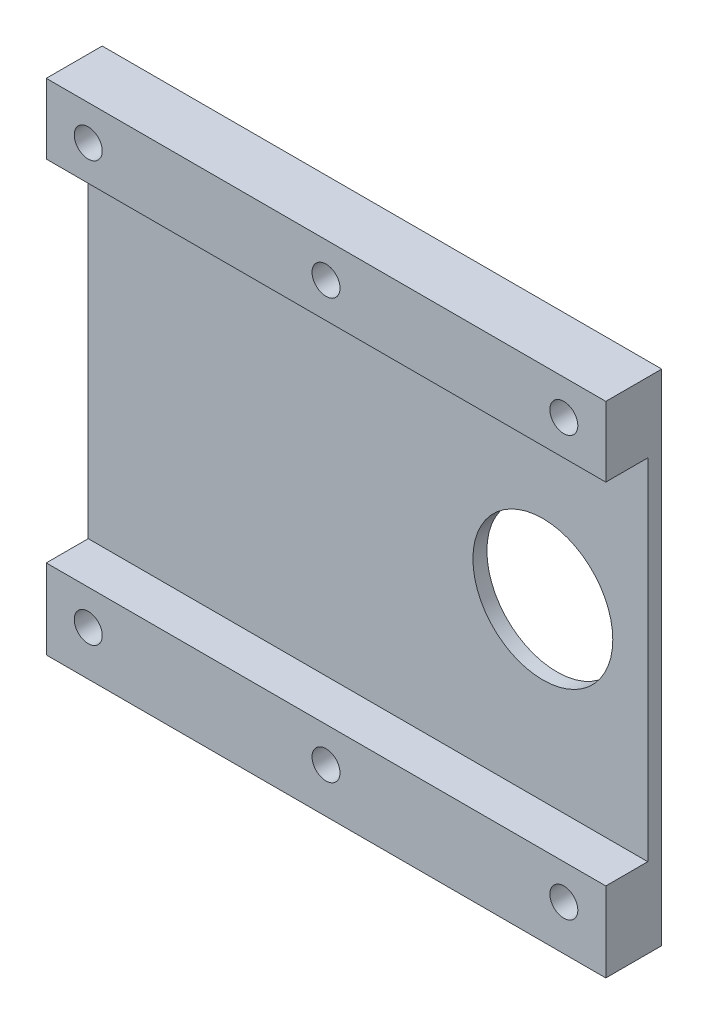
ISO-10303-21;
HEADER;
FILE_DESCRIPTION(('STEP AP214'),'2;1');
FILE_NAME('part.step','',(''),(''),'','','');
FILE_SCHEMA(('AUTOMOTIVE_DESIGN { 1 0 10303 214 1 1 1 1 }'));
ENDSEC;
DATA;
#1=APPLICATION_CONTEXT('core data for automotive mechanical design processes');
#2=APPLICATION_PROTOCOL_DEFINITION('international standard','automotive_design',2000,#1);
#3=PRODUCT_CONTEXT('',#1,'mechanical');
#4=PRODUCT('Part','Part','',(#3));
#5=PRODUCT_RELATED_PRODUCT_CATEGORY('part','',(#4));
#6=PRODUCT_DEFINITION_FORMATION('','',#4);
#7=PRODUCT_DEFINITION_CONTEXT('part definition',#1,'design');
#8=PRODUCT_DEFINITION('design','',#6,#7);
#9=PRODUCT_DEFINITION_SHAPE('','',#8);
#10=(LENGTH_UNIT() NAMED_UNIT(*) SI_UNIT(.MILLI.,.METRE.));
#11=(NAMED_UNIT(*) PLANE_ANGLE_UNIT() SI_UNIT($,.RADIAN.));
#12=(NAMED_UNIT(*) SI_UNIT($,.STERADIAN.) SOLID_ANGLE_UNIT());
#13=UNCERTAINTY_MEASURE_WITH_UNIT(LENGTH_MEASURE(1.E-05),#10,'distance_accuracy_value','');
#14=(GEOMETRIC_REPRESENTATION_CONTEXT(3) GLOBAL_UNCERTAINTY_ASSIGNED_CONTEXT((#13)) GLOBAL_UNIT_ASSIGNED_CONTEXT((#10,
#11,#12)) REPRESENTATION_CONTEXT('',''));
#15=CARTESIAN_POINT('',(0.,0.,0.));
#16=DIRECTION('',(0.,0.,1.));
#17=DIRECTION('',(1.,0.,0.));
#18=AXIS2_PLACEMENT_3D('',#15,#16,#17);
#19=CARTESIAN_POINT('',(0.,0.,4.));
#20=DIRECTION('',(0.,0.,1.));
#21=DIRECTION('',(1.,0.,0.));
#22=AXIS2_PLACEMENT_3D('',#19,#20,#21);
#23=PLANE('',#22);
#24=DIRECTION('',(1.,0.,0.));
#25=VECTOR('',#24,1.);
#26=CARTESIAN_POINT('',(-25.,-12.15,4.));
#27=LINE('',#26,#25);
#28=CARTESIAN_POINT('',(-20.,-12.15,4.));
#29=VERTEX_POINT('',#28);
#30=CARTESIAN_POINT('',(20.,-12.15,4.));
#31=VERTEX_POINT('',#30);
#32=EDGE_CURVE('E127',#29,#31,#27,.T.);
#33=ORIENTED_EDGE('',*,*,#32,.F.);
#34=DIRECTION('',(0.,-1.,0.));
#35=VECTOR('',#34,1.);
#36=CARTESIAN_POINT('',(-20.,17.85,4.));
#37=LINE('',#36,#35);
#38=CARTESIAN_POINT('',(-20.,-17.85,4.));
#39=VERTEX_POINT('',#38);
#40=EDGE_CURVE('E144',#29,#39,#37,.T.);
#41=ORIENTED_EDGE('',*,*,#40,.T.);
#42=DIRECTION('',(1.,0.,0.));
#43=VECTOR('',#42,1.);
#44=CARTESIAN_POINT('',(-20.,-17.85,4.));
#45=LINE('',#44,#43);
#46=CARTESIAN_POINT('',(20.,-17.85,4.));
#47=VERTEX_POINT('',#46);
#48=EDGE_CURVE('E62',#39,#47,#45,.T.);
#49=ORIENTED_EDGE('',*,*,#48,.T.);
#50=DIRECTION('',(0.,1.,0.));
#51=VECTOR('',#50,1.);
#52=CARTESIAN_POINT('',(20.,17.85,4.));
#53=LINE('',#52,#51);
#54=EDGE_CURVE('E134',#47,#31,#53,.T.);
#55=ORIENTED_EDGE('',*,*,#54,.T.);
#56=EDGE_LOOP('',(#33,#41,#49,#55));
#57=FACE_BOUND('',#56,.T.);
#58=CARTESIAN_POINT('',(17.,-14.65,4.));
#59=DIRECTION('',(0.,0.,1.));
#60=DIRECTION('',(1.,0.,0.));
#61=AXIS2_PLACEMENT_3D('',#58,#59,#60);
#62=CIRCLE('',#61,1.);
#63=CARTESIAN_POINT('',(18.,-14.65,4.));
#64=VERTEX_POINT('',#63);
#65=EDGE_CURVE('E183',#64,#64,#62,.T.);
#66=ORIENTED_EDGE('',*,*,#65,.F.);
#67=EDGE_LOOP('',(#66));
#68=FACE_BOUND('',#67,.T.);
#69=CARTESIAN_POINT('',(0.,-14.65,4.));
#70=DIRECTION('',(0.,0.,1.));
#71=DIRECTION('',(1.,0.,0.));
#72=AXIS2_PLACEMENT_3D('',#69,#70,#71);
#73=CIRCLE('',#72,1.);
#74=CARTESIAN_POINT('',(1.00000000000001,-14.65,4.));
#75=VERTEX_POINT('',#74);
#76=EDGE_CURVE('E195',#75,#75,#73,.T.);
#77=ORIENTED_EDGE('',*,*,#76,.F.);
#78=EDGE_LOOP('',(#77));
#79=FACE_BOUND('',#78,.T.);
#80=CARTESIAN_POINT('',(-17.,-14.65,4.));
#81=DIRECTION('',(0.,0.,1.));
#82=DIRECTION('',(1.,0.,0.));
#83=AXIS2_PLACEMENT_3D('',#80,#81,#82);
#84=CIRCLE('',#83,1.);
#85=CARTESIAN_POINT('',(-16.,-14.65,4.));
#86=VERTEX_POINT('',#85);
#87=EDGE_CURVE('E189',#86,#86,#84,.T.);
#88=ORIENTED_EDGE('',*,*,#87,.F.);
#89=EDGE_LOOP('',(#88));
#90=FACE_BOUND('',#89,.T.);
#91=ADVANCED_FACE('F37',(#57,#68,#79,#90),#23,.T.);
#92=DIRECTION('',(-1.,0.,0.));
#93=VECTOR('',#92,1.);
#94=CARTESIAN_POINT('',(-25.,12.85,4.));
#95=LINE('',#94,#93);
#96=CARTESIAN_POINT('',(20.,12.85,4.));
#97=VERTEX_POINT('',#96);
#98=CARTESIAN_POINT('',(-20.,12.85,4.));
#99=VERTEX_POINT('',#98);
#100=EDGE_CURVE('E115',#97,#99,#95,.T.);
#101=ORIENTED_EDGE('',*,*,#100,.F.);
#102=CARTESIAN_POINT('',(20.,17.85,4.));
#103=VERTEX_POINT('',#102);
#104=EDGE_CURVE('E91',#97,#103,#53,.T.);
#105=ORIENTED_EDGE('',*,*,#104,.T.);
#106=DIRECTION('',(-1.,0.,0.));
#107=VECTOR('',#106,1.);
#108=CARTESIAN_POINT('',(-20.,17.85,4.));
#109=LINE('',#108,#107);
#110=CARTESIAN_POINT('',(-20.,17.85,4.));
#111=VERTEX_POINT('',#110);
#112=EDGE_CURVE('E136',#103,#111,#109,.T.);
#113=ORIENTED_EDGE('',*,*,#112,.T.);
#114=EDGE_CURVE('E126',#111,#99,#37,.T.);
#115=ORIENTED_EDGE('',*,*,#114,.T.);
#116=EDGE_LOOP('',(#101,#105,#113,#115));
#117=FACE_BOUND('',#116,.T.);
#118=CARTESIAN_POINT('',(17.,15.35,4.));
#119=DIRECTION('',(0.,0.,1.));
#120=DIRECTION('',(1.,0.,0.));
#121=AXIS2_PLACEMENT_3D('',#118,#119,#120);
#122=CIRCLE('',#121,1.00000000000001);
#123=CARTESIAN_POINT('',(18.,15.35,4.));
#124=VERTEX_POINT('',#123);
#125=EDGE_CURVE('E201',#124,#124,#122,.T.);
#126=ORIENTED_EDGE('',*,*,#125,.F.);
#127=EDGE_LOOP('',(#126));
#128=FACE_BOUND('',#127,.T.);
#129=CARTESIAN_POINT('',(-17.,15.35,4.));
#130=DIRECTION('',(0.,0.,1.));
#131=DIRECTION('',(1.,0.,0.));
#132=AXIS2_PLACEMENT_3D('',#129,#130,#131);
#133=CIRCLE('',#132,1.);
#134=CARTESIAN_POINT('',(-16.,15.35,4.));
#135=VERTEX_POINT('',#134);
#136=EDGE_CURVE('E151',#135,#135,#133,.T.);
#137=ORIENTED_EDGE('',*,*,#136,.F.);
#138=EDGE_LOOP('',(#137));
#139=FACE_BOUND('',#138,.T.);
#140=CARTESIAN_POINT('',(0.,15.35,4.));
#141=DIRECTION('',(0.,0.,1.));
#142=DIRECTION('',(1.,0.,0.));
#143=AXIS2_PLACEMENT_3D('',#140,#141,#142);
#144=CIRCLE('',#143,1.);
#145=CARTESIAN_POINT('',(1.00000000000001,15.35,4.));
#146=VERTEX_POINT('',#145);
#147=EDGE_CURVE('E207',#146,#146,#144,.T.);
#148=ORIENTED_EDGE('',*,*,#147,.F.);
#149=EDGE_LOOP('',(#148));
#150=FACE_BOUND('',#149,.T.);
#151=ADVANCED_FACE('F123',(#117,#128,#139,#150),#23,.T.);
#152=CARTESIAN_POINT('',(0.,0.,0.));
#153=DIRECTION('',(0.,0.,1.));
#154=DIRECTION('',(1.,0.,0.));
#155=AXIS2_PLACEMENT_3D('',#152,#153,#154);
#156=PLANE('',#155);
#157=CARTESIAN_POINT('',(12.5000000000009,0.350000000000017,0.));
#158=DIRECTION('',(0.,0.,-1.));
#159=DIRECTION('',(-1.,0.,0.));
#160=AXIS2_PLACEMENT_3D('',#157,#158,#159);
#161=CIRCLE('',#160,5.00000000000083);
#162=CARTESIAN_POINT('',(7.50000000000006,0.350000000000017,0.));
#163=VERTEX_POINT('',#162);
#164=EDGE_CURVE('E451',#163,#163,#161,.T.);
#165=ORIENTED_EDGE('',*,*,#164,.F.);
#166=EDGE_LOOP('',(#165));
#167=FACE_BOUND('',#166,.T.);
#168=DIRECTION('',(0.,1.,0.));
#169=VECTOR('',#168,1.);
#170=CARTESIAN_POINT('',(20.,17.85,0.));
#171=LINE('',#170,#169);
#172=CARTESIAN_POINT('',(20.,-17.85,0.));
#173=VERTEX_POINT('',#172);
#174=CARTESIAN_POINT('',(20.,17.85,0.));
#175=VERTEX_POINT('',#174);
#176=EDGE_CURVE('E148',#173,#175,#171,.T.);
#177=ORIENTED_EDGE('',*,*,#176,.F.);
#178=DIRECTION('',(1.,0.,0.));
#179=VECTOR('',#178,1.);
#180=CARTESIAN_POINT('',(-20.,-17.85,0.));
#181=LINE('',#180,#179);
#182=CARTESIAN_POINT('',(-20.,-17.85,0.));
#183=VERTEX_POINT('',#182);
#184=EDGE_CURVE('E83',#183,#173,#181,.T.);
#185=ORIENTED_EDGE('',*,*,#184,.F.);
#186=DIRECTION('',(0.,-1.,0.));
#187=VECTOR('',#186,1.);
#188=CARTESIAN_POINT('',(-20.,17.85,0.));
#189=LINE('',#188,#187);
#190=CARTESIAN_POINT('',(-20.,17.85,0.));
#191=VERTEX_POINT('',#190);
#192=EDGE_CURVE('E137',#191,#183,#189,.T.);
#193=ORIENTED_EDGE('',*,*,#192,.F.);
#194=DIRECTION('',(-1.,0.,0.));
#195=VECTOR('',#194,1.);
#196=CARTESIAN_POINT('',(-20.,17.85,0.));
#197=LINE('',#196,#195);
#198=EDGE_CURVE('E150',#175,#191,#197,.T.);
#199=ORIENTED_EDGE('',*,*,#198,.F.);
#200=EDGE_LOOP('',(#177,#185,#193,#199));
#201=FACE_BOUND('',#200,.T.);
#202=CARTESIAN_POINT('',(-17.,15.35,0.));
#203=DIRECTION('',(0.,0.,1.));
#204=DIRECTION('',(1.,0.,0.));
#205=AXIS2_PLACEMENT_3D('',#202,#203,#204);
#206=CIRCLE('',#205,1.);
#207=CARTESIAN_POINT('',(-16.,15.35,0.));
#208=VERTEX_POINT('',#207);
#209=EDGE_CURVE('E141',#208,#208,#206,.T.);
#210=ORIENTED_EDGE('',*,*,#209,.T.);
#211=EDGE_LOOP('',(#210));
#212=FACE_BOUND('',#211,.T.);
#213=CARTESIAN_POINT('',(0.,15.35,0.));
#214=DIRECTION('',(0.,0.,1.));
#215=DIRECTION('',(1.,0.,0.));
#216=AXIS2_PLACEMENT_3D('',#213,#214,#215);
#217=CIRCLE('',#216,1.);
#218=CARTESIAN_POINT('',(1.00000000000001,15.35,0.));
#219=VERTEX_POINT('',#218);
#220=EDGE_CURVE('E204',#219,#219,#217,.T.);
#221=ORIENTED_EDGE('',*,*,#220,.T.);
#222=EDGE_LOOP('',(#221));
#223=FACE_BOUND('',#222,.T.);
#224=CARTESIAN_POINT('',(17.,15.35,0.));
#225=DIRECTION('',(0.,0.,1.));
#226=DIRECTION('',(1.,0.,0.));
#227=AXIS2_PLACEMENT_3D('',#224,#225,#226);
#228=CIRCLE('',#227,1.00000000000001);
#229=CARTESIAN_POINT('',(18.,15.35,0.));
#230=VERTEX_POINT('',#229);
#231=EDGE_CURVE('E198',#230,#230,#228,.T.);
#232=ORIENTED_EDGE('',*,*,#231,.T.);
#233=EDGE_LOOP('',(#232));
#234=FACE_BOUND('',#233,.T.);
#235=CARTESIAN_POINT('',(0.,-14.65,0.));
#236=DIRECTION('',(0.,0.,1.));
#237=DIRECTION('',(1.,0.,0.));
#238=AXIS2_PLACEMENT_3D('',#235,#236,#237);
#239=CIRCLE('',#238,1.);
#240=CARTESIAN_POINT('',(1.00000000000001,-14.65,0.));
#241=VERTEX_POINT('',#240);
#242=EDGE_CURVE('E192',#241,#241,#239,.T.);
#243=ORIENTED_EDGE('',*,*,#242,.T.);
#244=EDGE_LOOP('',(#243));
#245=FACE_BOUND('',#244,.T.);
#246=CARTESIAN_POINT('',(-17.,-14.65,0.));
#247=DIRECTION('',(0.,0.,1.));
#248=DIRECTION('',(1.,0.,0.));
#249=AXIS2_PLACEMENT_3D('',#246,#247,#248);
#250=CIRCLE('',#249,1.);
#251=CARTESIAN_POINT('',(-16.,-14.65,0.));
#252=VERTEX_POINT('',#251);
#253=EDGE_CURVE('E186',#252,#252,#250,.T.);
#254=ORIENTED_EDGE('',*,*,#253,.T.);
#255=EDGE_LOOP('',(#254));
#256=FACE_BOUND('',#255,.T.);
#257=CARTESIAN_POINT('',(17.,-14.65,0.));
#258=DIRECTION('',(0.,0.,1.));
#259=DIRECTION('',(1.,0.,0.));
#260=AXIS2_PLACEMENT_3D('',#257,#258,#259);
#261=CIRCLE('',#260,1.);
#262=CARTESIAN_POINT('',(18.,-14.65,0.));
#263=VERTEX_POINT('',#262);
#264=EDGE_CURVE('E182',#263,#263,#261,.T.);
#265=ORIENTED_EDGE('',*,*,#264,.T.);
#266=EDGE_LOOP('',(#265));
#267=FACE_BOUND('',#266,.T.);
#268=ADVANCED_FACE('F217',(#167,#201,#212,#223,#234,#245,#256,#267),#156,.F.);
#269=CARTESIAN_POINT('',(20.,17.85,4.));
#270=DIRECTION('',(-1.,0.,0.));
#271=DIRECTION('',(0.,0.,1.));
#272=AXIS2_PLACEMENT_3D('',#269,#270,#271);
#273=PLANE('',#272);
#274=DIRECTION('',(0.,1.,0.));
#275=VECTOR('',#274,1.);
#276=CARTESIAN_POINT('',(20.,17.85,1.));
#277=LINE('',#276,#275);
#278=CARTESIAN_POINT('',(20.,-12.15,1.));
#279=VERTEX_POINT('',#278);
#280=CARTESIAN_POINT('',(20.,12.85,1.));
#281=VERTEX_POINT('',#280);
#282=EDGE_CURVE('E120',#279,#281,#277,.T.);
#283=ORIENTED_EDGE('',*,*,#282,.F.);
#284=DIRECTION('',(0.,0.,1.));
#285=VECTOR('',#284,1.);
#286=CARTESIAN_POINT('',(20.,-12.15,4.));
#287=LINE('',#286,#285);
#288=EDGE_CURVE('E119',#279,#31,#287,.T.);
#289=ORIENTED_EDGE('',*,*,#288,.T.);
#290=ORIENTED_EDGE('',*,*,#54,.F.);
#291=DIRECTION('',(0.,0.,-1.));
#292=VECTOR('',#291,1.);
#293=CARTESIAN_POINT('',(20.,-17.85,4.));
#294=LINE('',#293,#292);
#295=EDGE_CURVE('E147',#47,#173,#294,.T.);
#296=ORIENTED_EDGE('',*,*,#295,.T.);
#297=ORIENTED_EDGE('',*,*,#176,.T.);
#298=DIRECTION('',(0.,0.,-1.));
#299=VECTOR('',#298,1.);
#300=CARTESIAN_POINT('',(20.,17.85,4.));
#301=LINE('',#300,#299);
#302=EDGE_CURVE('E133',#103,#175,#301,.T.);
#303=ORIENTED_EDGE('',*,*,#302,.F.);
#304=ORIENTED_EDGE('',*,*,#104,.F.);
#305=DIRECTION('',(0.,0.,-1.));
#306=VECTOR('',#305,1.);
#307=CARTESIAN_POINT('',(20.,12.85,4.));
#308=LINE('',#307,#306);
#309=EDGE_CURVE('E113',#97,#281,#308,.T.);
#310=ORIENTED_EDGE('',*,*,#309,.T.);
#311=EDGE_LOOP('',(#283,#289,#290,#296,#297,#303,#304,#310));
#312=FACE_BOUND('',#311,.T.);
#313=ADVANCED_FACE('F39',(#312),#273,.F.);
#314=CARTESIAN_POINT('',(-20.,17.85,4.));
#315=DIRECTION('',(0.,-1.,0.));
#316=DIRECTION('',(1.,0.,0.));
#317=AXIS2_PLACEMENT_3D('',#314,#315,#316);
#318=PLANE('',#317);
#319=ORIENTED_EDGE('',*,*,#198,.T.);
#320=DIRECTION('',(0.,0.,-1.));
#321=VECTOR('',#320,1.);
#322=CARTESIAN_POINT('',(-20.,17.85,4.));
#323=LINE('',#322,#321);
#324=EDGE_CURVE('E157',#111,#191,#323,.T.);
#325=ORIENTED_EDGE('',*,*,#324,.F.);
#326=ORIENTED_EDGE('',*,*,#112,.F.);
#327=ORIENTED_EDGE('',*,*,#302,.T.);
#328=EDGE_LOOP('',(#319,#325,#326,#327));
#329=FACE_BOUND('',#328,.T.);
#330=ADVANCED_FACE('F245',(#329),#318,.F.);
#331=CARTESIAN_POINT('',(-20.,17.85,4.));
#332=DIRECTION('',(1.,0.,0.));
#333=DIRECTION('',(0.,0.,-1.));
#334=AXIS2_PLACEMENT_3D('',#331,#332,#333);
#335=PLANE('',#334);
#336=ORIENTED_EDGE('',*,*,#40,.F.);
#337=DIRECTION('',(0.,0.,-1.));
#338=VECTOR('',#337,1.);
#339=CARTESIAN_POINT('',(-20.,-12.15,4.));
#340=LINE('',#339,#338);
#341=CARTESIAN_POINT('',(-20.,-12.15,1.));
#342=VERTEX_POINT('',#341);
#343=EDGE_CURVE('E11',#29,#342,#340,.T.);
#344=ORIENTED_EDGE('',*,*,#343,.T.);
#345=DIRECTION('',(0.,-1.,0.));
#346=VECTOR('',#345,1.);
#347=CARTESIAN_POINT('',(-20.,17.85,1.));
#348=LINE('',#347,#346);
#349=CARTESIAN_POINT('',(-20.,12.85,1.));
#350=VERTEX_POINT('',#349);
#351=EDGE_CURVE('E161',#350,#342,#348,.T.);
#352=ORIENTED_EDGE('',*,*,#351,.F.);
#353=DIRECTION('',(0.,0.,1.));
#354=VECTOR('',#353,1.);
#355=CARTESIAN_POINT('',(-20.,12.85,4.));
#356=LINE('',#355,#354);
#357=EDGE_CURVE('E46',#350,#99,#356,.T.);
#358=ORIENTED_EDGE('',*,*,#357,.T.);
#359=ORIENTED_EDGE('',*,*,#114,.F.);
#360=ORIENTED_EDGE('',*,*,#324,.T.);
#361=ORIENTED_EDGE('',*,*,#192,.T.);
#362=DIRECTION('',(0.,0.,-1.));
#363=VECTOR('',#362,1.);
#364=CARTESIAN_POINT('',(-20.,-17.85,4.));
#365=LINE('',#364,#363);
#366=EDGE_CURVE('E155',#39,#183,#365,.T.);
#367=ORIENTED_EDGE('',*,*,#366,.F.);
#368=EDGE_LOOP('',(#336,#344,#352,#358,#359,#360,#361,#367));
#369=FACE_BOUND('',#368,.T.);
#370=ADVANCED_FACE('F166',(#369),#335,.F.);
#371=CARTESIAN_POINT('',(-20.,-17.85,4.));
#372=DIRECTION('',(0.,1.,0.));
#373=DIRECTION('',(-1.,0.,0.));
#374=AXIS2_PLACEMENT_3D('',#371,#372,#373);
#375=PLANE('',#374);
#376=CARTESIAN_POINT('',(-7.5,-17.85,2.));
#377=DIRECTION('',(0.,-1.,0.));
#378=DIRECTION('',(1.,0.,0.));
#379=AXIS2_PLACEMENT_3D('',#376,#377,#378);
#380=CIRCLE('',#379,1.);
#381=CARTESIAN_POINT('',(-6.5,-17.85,2.));
#382=VERTEX_POINT('',#381);
#383=EDGE_CURVE('E461',#382,#382,#380,.T.);
#384=ORIENTED_EDGE('',*,*,#383,.F.);
#385=EDGE_LOOP('',(#384));
#386=FACE_BOUND('',#385,.T.);
#387=CARTESIAN_POINT('',(7.5,-17.85,2.));
#388=DIRECTION('',(0.,-1.,0.));
#389=DIRECTION('',(1.,0.,0.));
#390=AXIS2_PLACEMENT_3D('',#387,#388,#389);
#391=CIRCLE('',#390,1.);
#392=CARTESIAN_POINT('',(8.5,-17.85,2.));
#393=VERTEX_POINT('',#392);
#394=EDGE_CURVE('E453',#393,#393,#391,.T.);
#395=ORIENTED_EDGE('',*,*,#394,.F.);
#396=EDGE_LOOP('',(#395));
#397=FACE_BOUND('',#396,.T.);
#398=ORIENTED_EDGE('',*,*,#184,.T.);
#399=ORIENTED_EDGE('',*,*,#295,.F.);
#400=ORIENTED_EDGE('',*,*,#48,.F.);
#401=ORIENTED_EDGE('',*,*,#366,.T.);
#402=EDGE_LOOP('',(#398,#399,#400,#401));
#403=FACE_BOUND('',#402,.T.);
#404=ADVANCED_FACE('F223',(#386,#397,#403),#375,.F.);
#405=CARTESIAN_POINT('',(-17.,15.35,4.));
#406=DIRECTION('',(0.,0.,-1.));
#407=DIRECTION('',(-1.,0.,0.));
#408=AXIS2_PLACEMENT_3D('',#405,#406,#407);
#409=CYLINDRICAL_SURFACE('',#408,1.);
#410=ORIENTED_EDGE('',*,*,#136,.T.);
#411=EDGE_LOOP('',(#410));
#412=FACE_BOUND('',#411,.T.);
#413=ORIENTED_EDGE('',*,*,#209,.F.);
#414=EDGE_LOOP('',(#413));
#415=FACE_BOUND('',#414,.T.);
#416=ADVANCED_FACE('F220',(#412,#415),#409,.F.);
#417=CARTESIAN_POINT('',(0.,15.35,4.));
#418=DIRECTION('',(0.,0.,-1.));
#419=DIRECTION('',(-1.,0.,0.));
#420=AXIS2_PLACEMENT_3D('',#417,#418,#419);
#421=CYLINDRICAL_SURFACE('',#420,1.);
#422=ORIENTED_EDGE('',*,*,#147,.T.);
#423=EDGE_LOOP('',(#422));
#424=FACE_BOUND('',#423,.T.);
#425=ORIENTED_EDGE('',*,*,#220,.F.);
#426=EDGE_LOOP('',(#425));
#427=FACE_BOUND('',#426,.T.);
#428=ADVANCED_FACE('F222',(#424,#427),#421,.F.);
#429=CARTESIAN_POINT('',(17.,15.35,4.));
#430=DIRECTION('',(0.,0.,-1.));
#431=DIRECTION('',(-1.,0.,0.));
#432=AXIS2_PLACEMENT_3D('',#429,#430,#431);
#433=CYLINDRICAL_SURFACE('',#432,1.00000000000001);
#434=ORIENTED_EDGE('',*,*,#125,.T.);
#435=EDGE_LOOP('',(#434));
#436=FACE_BOUND('',#435,.T.);
#437=ORIENTED_EDGE('',*,*,#231,.F.);
#438=EDGE_LOOP('',(#437));
#439=FACE_BOUND('',#438,.T.);
#440=ADVANCED_FACE('F229',(#436,#439),#433,.F.);
#441=CARTESIAN_POINT('',(0.,-14.65,4.));
#442=DIRECTION('',(0.,0.,-1.));
#443=DIRECTION('',(-1.,0.,0.));
#444=AXIS2_PLACEMENT_3D('',#441,#442,#443);
#445=CYLINDRICAL_SURFACE('',#444,1.);
#446=ORIENTED_EDGE('',*,*,#76,.T.);
#447=EDGE_LOOP('',(#446));
#448=FACE_BOUND('',#447,.T.);
#449=ORIENTED_EDGE('',*,*,#242,.F.);
#450=EDGE_LOOP('',(#449));
#451=FACE_BOUND('',#450,.T.);
#452=ADVANCED_FACE('F298',(#448,#451),#445,.F.);
#453=CARTESIAN_POINT('',(-17.,-14.65,4.));
#454=DIRECTION('',(0.,0.,-1.));
#455=DIRECTION('',(-1.,0.,0.));
#456=AXIS2_PLACEMENT_3D('',#453,#454,#455);
#457=CYLINDRICAL_SURFACE('',#456,1.);
#458=ORIENTED_EDGE('',*,*,#87,.T.);
#459=EDGE_LOOP('',(#458));
#460=FACE_BOUND('',#459,.T.);
#461=ORIENTED_EDGE('',*,*,#253,.F.);
#462=EDGE_LOOP('',(#461));
#463=FACE_BOUND('',#462,.T.);
#464=ADVANCED_FACE('F287',(#460,#463),#457,.F.);
#465=CARTESIAN_POINT('',(17.,-14.65,4.));
#466=DIRECTION('',(0.,0.,-1.));
#467=DIRECTION('',(-1.,0.,0.));
#468=AXIS2_PLACEMENT_3D('',#465,#466,#467);
#469=CYLINDRICAL_SURFACE('',#468,1.);
#470=ORIENTED_EDGE('',*,*,#65,.T.);
#471=EDGE_LOOP('',(#470));
#472=FACE_BOUND('',#471,.T.);
#473=ORIENTED_EDGE('',*,*,#264,.F.);
#474=EDGE_LOOP('',(#473));
#475=FACE_BOUND('',#474,.T.);
#476=ADVANCED_FACE('F282',(#472,#475),#469,.F.);
#477=CARTESIAN_POINT('',(-25.,-12.15,1.));
#478=DIRECTION('',(0.,-1.,0.));
#479=DIRECTION('',(1.,0.,0.));
#480=AXIS2_PLACEMENT_3D('',#477,#478,#479);
#481=PLANE('',#480);
#482=DIRECTION('',(1.,0.,0.));
#483=VECTOR('',#482,1.);
#484=CARTESIAN_POINT('',(-25.,-12.15,1.));
#485=LINE('',#484,#483);
#486=EDGE_CURVE('E170',#342,#279,#485,.T.);
#487=ORIENTED_EDGE('',*,*,#486,.F.);
#488=ORIENTED_EDGE('',*,*,#343,.F.);
#489=ORIENTED_EDGE('',*,*,#32,.T.);
#490=ORIENTED_EDGE('',*,*,#288,.F.);
#491=EDGE_LOOP('',(#487,#488,#489,#490));
#492=FACE_BOUND('',#491,.T.);
#493=ADVANCED_FACE('F172',(#492),#481,.F.);
#494=CARTESIAN_POINT('',(-25.,12.85,1.));
#495=DIRECTION('',(0.,1.,0.));
#496=DIRECTION('',(-1.,0.,0.));
#497=AXIS2_PLACEMENT_3D('',#494,#495,#496);
#498=PLANE('',#497);
#499=ORIENTED_EDGE('',*,*,#100,.T.);
#500=ORIENTED_EDGE('',*,*,#357,.F.);
#501=DIRECTION('',(-1.,0.,0.));
#502=VECTOR('',#501,1.);
#503=CARTESIAN_POINT('',(-25.,12.85,1.));
#504=LINE('',#503,#502);
#505=EDGE_CURVE('E53',#281,#350,#504,.T.);
#506=ORIENTED_EDGE('',*,*,#505,.F.);
#507=ORIENTED_EDGE('',*,*,#309,.F.);
#508=EDGE_LOOP('',(#499,#500,#506,#507));
#509=FACE_BOUND('',#508,.T.);
#510=ADVANCED_FACE('F114',(#509),#498,.F.);
#511=CARTESIAN_POINT('',(0.,0.,1.));
#512=DIRECTION('',(0.,0.,1.));
#513=DIRECTION('',(1.,0.,0.));
#514=AXIS2_PLACEMENT_3D('',#511,#512,#513);
#515=PLANE('',#514);
#516=CARTESIAN_POINT('',(12.5000000000009,0.350000000000017,1.));
#517=DIRECTION('',(0.,0.,1.));
#518=DIRECTION('',(1.,0.,0.));
#519=AXIS2_PLACEMENT_3D('',#516,#517,#518);
#520=CIRCLE('',#519,5.00000000000083);
#521=CARTESIAN_POINT('',(17.5000000000017,0.350000000000017,1.));
#522=VERTEX_POINT('',#521);
#523=EDGE_CURVE('E41',#522,#522,#520,.T.);
#524=ORIENTED_EDGE('',*,*,#523,.F.);
#525=EDGE_LOOP('',(#524));
#526=FACE_BOUND('',#525,.T.);
#527=ORIENTED_EDGE('',*,*,#282,.T.);
#528=ORIENTED_EDGE('',*,*,#505,.T.);
#529=ORIENTED_EDGE('',*,*,#351,.T.);
#530=ORIENTED_EDGE('',*,*,#486,.T.);
#531=EDGE_LOOP('',(#527,#528,#529,#530));
#532=FACE_BOUND('',#531,.T.);
#533=ADVANCED_FACE('F169',(#526,#532),#515,.T.);
#534=CARTESIAN_POINT('',(7.5,-14.85,2.));
#535=DIRECTION('',(0.,-1.,0.));
#536=DIRECTION('',(1.,0.,0.));
#537=AXIS2_PLACEMENT_3D('',#534,#535,#536);
#538=CYLINDRICAL_SURFACE('',#537,1.);
#539=CARTESIAN_POINT('',(7.5,-14.85,2.));
#540=DIRECTION('',(0.,-1.,0.));
#541=DIRECTION('',(1.,0.,0.));
#542=AXIS2_PLACEMENT_3D('',#539,#540,#541);
#543=CIRCLE('',#542,1.);
#544=CARTESIAN_POINT('',(8.5,-14.85,2.));
#545=VERTEX_POINT('',#544);
#546=EDGE_CURVE('E450',#545,#545,#543,.T.);
#547=ORIENTED_EDGE('',*,*,#546,.F.);
#548=EDGE_LOOP('',(#547));
#549=FACE_BOUND('',#548,.T.);
#550=ORIENTED_EDGE('',*,*,#394,.T.);
#551=EDGE_LOOP('',(#550));
#552=FACE_BOUND('',#551,.T.);
#553=ADVANCED_FACE('F365',(#549,#552),#538,.F.);
#554=CARTESIAN_POINT('',(7.5,-14.85,2.));
#555=DIRECTION('',(0.,-1.,0.));
#556=DIRECTION('',(1.,0.,0.));
#557=AXIS2_PLACEMENT_3D('',#554,#555,#556);
#558=PLANE('',#557);
#559=ORIENTED_EDGE('',*,*,#546,.T.);
#560=EDGE_LOOP('',(#559));
#561=FACE_BOUND('',#560,.T.);
#562=ADVANCED_FACE('F370',(#561),#558,.T.);
#563=CARTESIAN_POINT('',(-7.5,-14.85,2.));
#564=DIRECTION('',(0.,-1.,0.));
#565=DIRECTION('',(1.,0.,0.));
#566=AXIS2_PLACEMENT_3D('',#563,#564,#565);
#567=CYLINDRICAL_SURFACE('',#566,1.);
#568=CARTESIAN_POINT('',(-7.5,-14.85,2.));
#569=DIRECTION('',(0.,-1.,0.));
#570=DIRECTION('',(1.,0.,0.));
#571=AXIS2_PLACEMENT_3D('',#568,#569,#570);
#572=CIRCLE('',#571,1.);
#573=CARTESIAN_POINT('',(-6.5,-14.85,2.));
#574=VERTEX_POINT('',#573);
#575=EDGE_CURVE('E128',#574,#574,#572,.T.);
#576=ORIENTED_EDGE('',*,*,#575,.F.);
#577=EDGE_LOOP('',(#576));
#578=FACE_BOUND('',#577,.T.);
#579=ORIENTED_EDGE('',*,*,#383,.T.);
#580=EDGE_LOOP('',(#579));
#581=FACE_BOUND('',#580,.T.);
#582=ADVANCED_FACE('F383',(#578,#581),#567,.F.);
#583=CARTESIAN_POINT('',(-7.5,-14.85,2.));
#584=DIRECTION('',(0.,-1.,0.));
#585=DIRECTION('',(1.,0.,0.));
#586=AXIS2_PLACEMENT_3D('',#583,#584,#585);
#587=PLANE('',#586);
#588=ORIENTED_EDGE('',*,*,#575,.T.);
#589=EDGE_LOOP('',(#588));
#590=FACE_BOUND('',#589,.T.);
#591=ADVANCED_FACE('F393',(#590),#587,.T.);
#592=CARTESIAN_POINT('',(12.5000000000009,0.350000000000017,4.));
#593=DIRECTION('',(0.,0.,-1.));
#594=DIRECTION('',(-1.,0.,0.));
#595=AXIS2_PLACEMENT_3D('',#592,#593,#594);
#596=CYLINDRICAL_SURFACE('',#595,5.00000000000083);
#597=ORIENTED_EDGE('',*,*,#523,.T.);
#598=EDGE_LOOP('',(#597));
#599=FACE_BOUND('',#598,.T.);
#600=ORIENTED_EDGE('',*,*,#164,.T.);
#601=EDGE_LOOP('',(#600));
#602=FACE_BOUND('',#601,.T.);
#603=ADVANCED_FACE('F403',(#599,#602),#596,.F.);
#604=CLOSED_SHELL('',(#91,#151,#268,#313,#330,#370,#404,#416,#428,#440,#452,#464,#476,#493,#510,
#533,#553,#562,#582,#591,#603));
#605=MANIFOLD_SOLID_BREP('B2',#604);
#606=ADVANCED_BREP_SHAPE_REPRESENTATION('',(#18,#605),#14);
#607=SHAPE_DEFINITION_REPRESENTATION(#9,#606);
ENDSEC;
END-ISO-10303-21;
